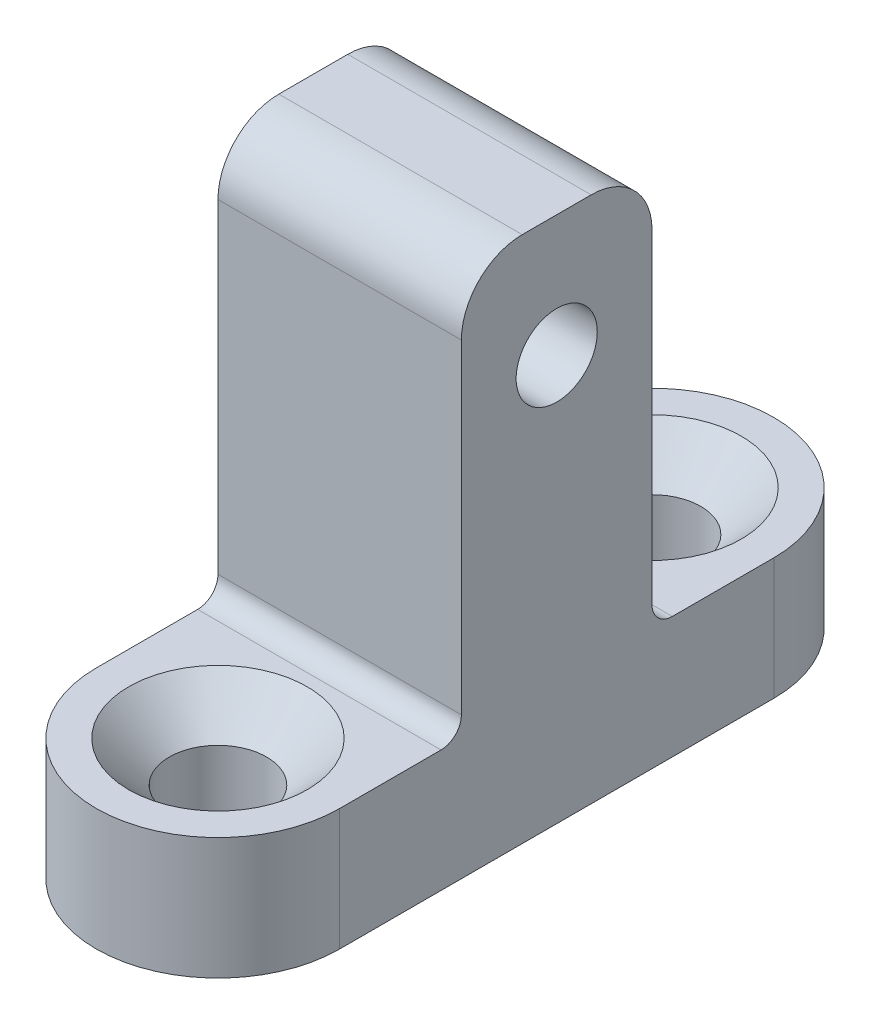
ISO-10303-21;
HEADER;
FILE_DESCRIPTION(('STEP AP214'),'2;1');
FILE_NAME('part.step','',(''),(''),'','','');
FILE_SCHEMA(('AUTOMOTIVE_DESIGN { 1 0 10303 214 1 1 1 1 }'));
ENDSEC;
DATA;
#1=APPLICATION_CONTEXT('core data for automotive mechanical design processes');
#2=APPLICATION_PROTOCOL_DEFINITION('international standard','automotive_design',2000,#1);
#3=PRODUCT_CONTEXT('',#1,'mechanical');
#4=PRODUCT('Part','Part','',(#3));
#5=PRODUCT_RELATED_PRODUCT_CATEGORY('part','',(#4));
#6=PRODUCT_DEFINITION_FORMATION('','',#4);
#7=PRODUCT_DEFINITION_CONTEXT('part definition',#1,'design');
#8=PRODUCT_DEFINITION('design','',#6,#7);
#9=PRODUCT_DEFINITION_SHAPE('','',#8);
#10=(LENGTH_UNIT() NAMED_UNIT(*) SI_UNIT(.MILLI.,.METRE.));
#11=(NAMED_UNIT(*) PLANE_ANGLE_UNIT() SI_UNIT($,.RADIAN.));
#12=(NAMED_UNIT(*) SI_UNIT($,.STERADIAN.) SOLID_ANGLE_UNIT());
#13=UNCERTAINTY_MEASURE_WITH_UNIT(LENGTH_MEASURE(1.E-05),#10,'distance_accuracy_value','');
#14=(GEOMETRIC_REPRESENTATION_CONTEXT(3) GLOBAL_UNCERTAINTY_ASSIGNED_CONTEXT((#13)) GLOBAL_UNIT_ASSIGNED_CONTEXT((#10,
#11,#12)) REPRESENTATION_CONTEXT('',''));
#15=CARTESIAN_POINT('',(0.,0.,0.));
#16=DIRECTION('',(0.,0.,1.));
#17=DIRECTION('',(1.,0.,0.));
#18=AXIS2_PLACEMENT_3D('',#15,#16,#17);
#19=CARTESIAN_POINT('',(0.,13.,2.35));
#20=DIRECTION('',(0.,0.,-1.));
#21=DIRECTION('',(-1.,0.,0.));
#22=AXIS2_PLACEMENT_3D('',#19,#20,#21);
#23=PLANE('',#22);
#24=DIRECTION('',(0.,-1.,0.));
#25=VECTOR('',#24,1.);
#26=CARTESIAN_POINT('',(3.,13.,2.35));
#27=LINE('',#26,#25);
#28=CARTESIAN_POINT('',(3.,11.5,2.35));
#29=VERTEX_POINT('',#28);
#30=CARTESIAN_POINT('',(3.,3.5,2.35));
#31=VERTEX_POINT('',#30);
#32=EDGE_CURVE('E216',#29,#31,#27,.T.);
#33=ORIENTED_EDGE('',*,*,#32,.F.);
#34=DIRECTION('',(1.,0.,0.));
#35=VECTOR('',#34,1.);
#36=CARTESIAN_POINT('',(-3.,11.5,2.35));
#37=LINE('',#36,#35);
#38=CARTESIAN_POINT('',(-3.,11.5,2.35));
#39=VERTEX_POINT('',#38);
#40=EDGE_CURVE('E74',#29,#39,#37,.F.);
#41=ORIENTED_EDGE('',*,*,#40,.T.);
#42=DIRECTION('',(0.,-1.,0.));
#43=VECTOR('',#42,1.);
#44=CARTESIAN_POINT('',(-3.,13.,2.35));
#45=LINE('',#44,#43);
#46=CARTESIAN_POINT('',(-3.,3.5,2.35));
#47=VERTEX_POINT('',#46);
#48=EDGE_CURVE('E207',#39,#47,#45,.T.);
#49=ORIENTED_EDGE('',*,*,#48,.T.);
#50=DIRECTION('',(1.,0.,0.));
#51=VECTOR('',#50,1.);
#52=CARTESIAN_POINT('',(0.,3.5,2.35));
#53=LINE('',#52,#51);
#54=EDGE_CURVE('E302',#47,#31,#53,.T.);
#55=ORIENTED_EDGE('',*,*,#54,.T.);
#56=EDGE_LOOP('',(#33,#41,#49,#55));
#57=FACE_BOUND('',#56,.T.);
#58=ADVANCED_FACE('F50',(#57),#23,.F.);
#59=CARTESIAN_POINT('',(3.,13.,0.));
#60=DIRECTION('',(1.,0.,0.));
#61=DIRECTION('',(0.,0.,-1.));
#62=AXIS2_PLACEMENT_3D('',#59,#60,#61);
#63=PLANE('',#62);
#64=CARTESIAN_POINT('',(3.000012,10.,0.));
#65=DIRECTION('',(1.,0.,0.));
#66=DIRECTION('',(0.,0.,-1.));
#67=AXIS2_PLACEMENT_3D('',#64,#65,#66);
#68=CIRCLE('',#67,1.);
#69=CARTESIAN_POINT('',(3.000012,10.,-1.));
#70=VERTEX_POINT('',#69);
#71=EDGE_CURVE('E228',#70,#70,#68,.T.);
#72=ORIENTED_EDGE('',*,*,#71,.F.);
#73=EDGE_LOOP('',(#72));
#74=FACE_BOUND('',#73,.T.);
#75=DIRECTION('',(0.,0.,1.));
#76=VECTOR('',#75,1.);
#77=CARTESIAN_POINT('',(3.,13.,0.));
#78=LINE('',#77,#76);
#79=CARTESIAN_POINT('',(3.,13.,-0.85));
#80=VERTEX_POINT('',#79);
#81=CARTESIAN_POINT('',(3.,13.,0.849999999999998));
#82=VERTEX_POINT('',#81);
#83=EDGE_CURVE('E199',#80,#82,#78,.T.);
#84=ORIENTED_EDGE('',*,*,#83,.T.);
#85=CARTESIAN_POINT('',(3.,11.5,0.849999999999998));
#86=DIRECTION('',(1.,0.,0.));
#87=DIRECTION('',(0.,0.,-1.));
#88=AXIS2_PLACEMENT_3D('',#85,#86,#87);
#89=CIRCLE('',#88,1.5);
#90=EDGE_CURVE('E280',#82,#29,#89,.T.);
#91=ORIENTED_EDGE('',*,*,#90,.T.);
#92=ORIENTED_EDGE('',*,*,#32,.T.);
#93=CARTESIAN_POINT('',(3.,3.5,2.85));
#94=DIRECTION('',(1.,0.,0.));
#95=DIRECTION('',(0.,0.,-1.));
#96=AXIS2_PLACEMENT_3D('',#93,#94,#95);
#97=CIRCLE('',#96,0.5);
#98=CARTESIAN_POINT('',(3.,3.,2.85));
#99=VERTEX_POINT('',#98);
#100=EDGE_CURVE('E292',#31,#99,#97,.F.);
#101=ORIENTED_EDGE('',*,*,#100,.T.);
#102=DIRECTION('',(0.,0.,1.));
#103=VECTOR('',#102,1.);
#104=CARTESIAN_POINT('',(3.,3.,0.));
#105=LINE('',#104,#103);
#106=CARTESIAN_POINT('',(3.,3.,5.35));
#107=VERTEX_POINT('',#106);
#108=EDGE_CURVE('E163',#99,#107,#105,.T.);
#109=ORIENTED_EDGE('',*,*,#108,.T.);
#110=DIRECTION('',(0.,-1.,0.));
#111=VECTOR('',#110,1.);
#112=CARTESIAN_POINT('',(3.,3.,5.35));
#113=LINE('',#112,#111);
#114=CARTESIAN_POINT('',(3.,0.,5.35));
#115=VERTEX_POINT('',#114);
#116=EDGE_CURVE('E158',#107,#115,#113,.T.);
#117=ORIENTED_EDGE('',*,*,#116,.T.);
#118=DIRECTION('',(0.,0.,1.));
#119=VECTOR('',#118,1.);
#120=CARTESIAN_POINT('',(3.,0.,0.));
#121=LINE('',#120,#119);
#122=CARTESIAN_POINT('',(3.,0.,-5.35));
#123=VERTEX_POINT('',#122);
#124=EDGE_CURVE('E166',#123,#115,#121,.T.);
#125=ORIENTED_EDGE('',*,*,#124,.F.);
#126=DIRECTION('',(0.,-1.,0.));
#127=VECTOR('',#126,1.);
#128=CARTESIAN_POINT('',(3.,3.,-5.35));
#129=LINE('',#128,#127);
#130=CARTESIAN_POINT('',(3.,3.,-5.35));
#131=VERTEX_POINT('',#130);
#132=EDGE_CURVE('E192',#131,#123,#129,.T.);
#133=ORIENTED_EDGE('',*,*,#132,.F.);
#134=DIRECTION('',(0.,0.,1.));
#135=VECTOR('',#134,1.);
#136=CARTESIAN_POINT('',(3.,3.,0.));
#137=LINE('',#136,#135);
#138=CARTESIAN_POINT('',(3.,3.,-2.85));
#139=VERTEX_POINT('',#138);
#140=EDGE_CURVE('E176',#131,#139,#137,.T.);
#141=ORIENTED_EDGE('',*,*,#140,.T.);
#142=CARTESIAN_POINT('',(3.,3.5,-2.85));
#143=DIRECTION('',(1.,0.,0.));
#144=DIRECTION('',(0.,0.,-1.));
#145=AXIS2_PLACEMENT_3D('',#142,#143,#144);
#146=CIRCLE('',#145,0.5);
#147=CARTESIAN_POINT('',(3.,3.5,-2.35));
#148=VERTEX_POINT('',#147);
#149=EDGE_CURVE('E296',#139,#148,#146,.F.);
#150=ORIENTED_EDGE('',*,*,#149,.T.);
#151=DIRECTION('',(0.,-1.,0.));
#152=VECTOR('',#151,1.);
#153=CARTESIAN_POINT('',(3.,13.,-2.35));
#154=LINE('',#153,#152);
#155=CARTESIAN_POINT('',(3.,11.5,-2.35));
#156=VERTEX_POINT('',#155);
#157=EDGE_CURVE('E212',#156,#148,#154,.T.);
#158=ORIENTED_EDGE('',*,*,#157,.F.);
#159=CARTESIAN_POINT('',(3.,11.5,-0.85));
#160=DIRECTION('',(1.,0.,0.));
#161=DIRECTION('',(0.,0.,-1.));
#162=AXIS2_PLACEMENT_3D('',#159,#160,#161);
#163=CIRCLE('',#162,1.5);
#164=EDGE_CURVE('E283',#156,#80,#163,.T.);
#165=ORIENTED_EDGE('',*,*,#164,.T.);
#166=EDGE_LOOP('',(#84,#91,#92,#101,#109,#117,#125,#133,#141,#150,#158,#165));
#167=FACE_BOUND('',#166,.T.);
#168=ADVANCED_FACE('F235',(#74,#167),#63,.T.);
#169=CARTESIAN_POINT('',(0.,13.,-2.35));
#170=DIRECTION('',(0.,0.,-1.));
#171=DIRECTION('',(-1.,0.,0.));
#172=AXIS2_PLACEMENT_3D('',#169,#170,#171);
#173=PLANE('',#172);
#174=DIRECTION('',(0.,-1.,0.));
#175=VECTOR('',#174,1.);
#176=CARTESIAN_POINT('',(-3.,13.,-2.35));
#177=LINE('',#176,#175);
#178=CARTESIAN_POINT('',(-3.,11.5,-2.35));
#179=VERTEX_POINT('',#178);
#180=CARTESIAN_POINT('',(-3.,3.5,-2.35));
#181=VERTEX_POINT('',#180);
#182=EDGE_CURVE('E211',#179,#181,#177,.T.);
#183=ORIENTED_EDGE('',*,*,#182,.F.);
#184=DIRECTION('',(1.,0.,0.));
#185=VECTOR('',#184,1.);
#186=CARTESIAN_POINT('',(0.,11.5,-2.35));
#187=LINE('',#186,#185);
#188=EDGE_CURVE('E11',#179,#156,#187,.T.);
#189=ORIENTED_EDGE('',*,*,#188,.T.);
#190=ORIENTED_EDGE('',*,*,#157,.T.);
#191=DIRECTION('',(1.,0.,0.));
#192=VECTOR('',#191,1.);
#193=CARTESIAN_POINT('',(-3.,3.5,-2.35));
#194=LINE('',#193,#192);
#195=EDGE_CURVE('E310',#148,#181,#194,.F.);
#196=ORIENTED_EDGE('',*,*,#195,.T.);
#197=EDGE_LOOP('',(#183,#189,#190,#196));
#198=FACE_BOUND('',#197,.T.);
#199=ADVANCED_FACE('F245',(#198),#173,.T.);
#200=CARTESIAN_POINT('',(-3.,13.,0.));
#201=DIRECTION('',(1.,0.,0.));
#202=DIRECTION('',(0.,0.,-1.));
#203=AXIS2_PLACEMENT_3D('',#200,#201,#202);
#204=PLANE('',#203);
#205=CARTESIAN_POINT('',(-3.,10.,0.));
#206=DIRECTION('',(1.,0.,0.));
#207=DIRECTION('',(0.,0.,-1.));
#208=AXIS2_PLACEMENT_3D('',#205,#206,#207);
#209=CIRCLE('',#208,1.);
#210=CARTESIAN_POINT('',(-3.,10.,-1.));
#211=VERTEX_POINT('',#210);
#212=EDGE_CURVE('E191',#211,#211,#209,.T.);
#213=ORIENTED_EDGE('',*,*,#212,.T.);
#214=EDGE_LOOP('',(#213));
#215=FACE_BOUND('',#214,.T.);
#216=ORIENTED_EDGE('',*,*,#48,.F.);
#217=CARTESIAN_POINT('',(-3.,11.5,0.849999999999999));
#218=DIRECTION('',(1.,0.,0.));
#219=DIRECTION('',(0.,0.,-1.));
#220=AXIS2_PLACEMENT_3D('',#217,#218,#219);
#221=CIRCLE('',#220,1.5);
#222=CARTESIAN_POINT('',(-3.,13.,0.849999999999999));
#223=VERTEX_POINT('',#222);
#224=EDGE_CURVE('E57',#39,#223,#221,.F.);
#225=ORIENTED_EDGE('',*,*,#224,.T.);
#226=DIRECTION('',(0.,0.,1.));
#227=VECTOR('',#226,1.);
#228=CARTESIAN_POINT('',(-3.,13.,0.));
#229=LINE('',#228,#227);
#230=CARTESIAN_POINT('',(-3.,13.,-0.849999999999999));
#231=VERTEX_POINT('',#230);
#232=EDGE_CURVE('E205',#231,#223,#229,.T.);
#233=ORIENTED_EDGE('',*,*,#232,.F.);
#234=CARTESIAN_POINT('',(-3.,11.5,-0.849999999999999));
#235=DIRECTION('',(1.,0.,0.));
#236=DIRECTION('',(0.,0.,-1.));
#237=AXIS2_PLACEMENT_3D('',#234,#235,#236);
#238=CIRCLE('',#237,1.5);
#239=EDGE_CURVE('E65',#231,#179,#238,.F.);
#240=ORIENTED_EDGE('',*,*,#239,.T.);
#241=ORIENTED_EDGE('',*,*,#182,.T.);
#242=CARTESIAN_POINT('',(-3.,3.5,-2.85));
#243=DIRECTION('',(1.,0.,0.));
#244=DIRECTION('',(0.,0.,-1.));
#245=AXIS2_PLACEMENT_3D('',#242,#243,#244);
#246=CIRCLE('',#245,0.5);
#247=CARTESIAN_POINT('',(-3.,3.,-2.85));
#248=VERTEX_POINT('',#247);
#249=EDGE_CURVE('E294',#181,#248,#246,.T.);
#250=ORIENTED_EDGE('',*,*,#249,.T.);
#251=DIRECTION('',(0.,0.,1.));
#252=VECTOR('',#251,1.);
#253=CARTESIAN_POINT('',(-3.,3.,0.));
#254=LINE('',#253,#252);
#255=CARTESIAN_POINT('',(-3.,3.,-5.35));
#256=VERTEX_POINT('',#255);
#257=EDGE_CURVE('E183',#256,#248,#254,.T.);
#258=ORIENTED_EDGE('',*,*,#257,.F.);
#259=DIRECTION('',(0.,-1.,0.));
#260=VECTOR('',#259,1.);
#261=CARTESIAN_POINT('',(-3.,3.,-5.35));
#262=LINE('',#261,#260);
#263=CARTESIAN_POINT('',(-3.,0.,-5.35));
#264=VERTEX_POINT('',#263);
#265=EDGE_CURVE('E189',#256,#264,#262,.T.);
#266=ORIENTED_EDGE('',*,*,#265,.T.);
#267=DIRECTION('',(0.,0.,1.));
#268=VECTOR('',#267,1.);
#269=CARTESIAN_POINT('',(-3.,0.,0.));
#270=LINE('',#269,#268);
#271=CARTESIAN_POINT('',(-3.,0.,5.35));
#272=VERTEX_POINT('',#271);
#273=EDGE_CURVE('E164',#264,#272,#270,.T.);
#274=ORIENTED_EDGE('',*,*,#273,.T.);
#275=DIRECTION('',(0.,-1.,0.));
#276=VECTOR('',#275,1.);
#277=CARTESIAN_POINT('',(-3.,3.,5.35));
#278=LINE('',#277,#276);
#279=CARTESIAN_POINT('',(-3.,3.,5.35));
#280=VERTEX_POINT('',#279);
#281=EDGE_CURVE('E156',#280,#272,#278,.T.);
#282=ORIENTED_EDGE('',*,*,#281,.F.);
#283=DIRECTION('',(0.,0.,1.));
#284=VECTOR('',#283,1.);
#285=CARTESIAN_POINT('',(-3.,3.,0.));
#286=LINE('',#285,#284);
#287=CARTESIAN_POINT('',(-3.,3.,2.85));
#288=VERTEX_POINT('',#287);
#289=EDGE_CURVE('E138',#288,#280,#286,.T.);
#290=ORIENTED_EDGE('',*,*,#289,.F.);
#291=CARTESIAN_POINT('',(-3.,3.5,2.85));
#292=DIRECTION('',(1.,0.,0.));
#293=DIRECTION('',(0.,0.,-1.));
#294=AXIS2_PLACEMENT_3D('',#291,#292,#293);
#295=CIRCLE('',#294,0.5);
#296=EDGE_CURVE('E288',#288,#47,#295,.T.);
#297=ORIENTED_EDGE('',*,*,#296,.T.);
#298=EDGE_LOOP('',(#216,#225,#233,#240,#241,#250,#258,#266,#274,#282,#290,#297));
#299=FACE_BOUND('',#298,.T.);
#300=ADVANCED_FACE('F161',(#215,#299),#204,.F.);
#301=CARTESIAN_POINT('',(0.,13.,0.));
#302=DIRECTION('',(0.,1.,0.));
#303=DIRECTION('',(0.,0.,1.));
#304=AXIS2_PLACEMENT_3D('',#301,#302,#303);
#305=PLANE('',#304);
#306=ORIENTED_EDGE('',*,*,#232,.T.);
#307=DIRECTION('',(1.,0.,0.));
#308=VECTOR('',#307,1.);
#309=CARTESIAN_POINT('',(3.,13.,0.849999999999998));
#310=LINE('',#309,#308);
#311=EDGE_CURVE('E272',#223,#82,#310,.T.);
#312=ORIENTED_EDGE('',*,*,#311,.T.);
#313=ORIENTED_EDGE('',*,*,#83,.F.);
#314=DIRECTION('',(1.,0.,0.));
#315=VECTOR('',#314,1.);
#316=CARTESIAN_POINT('',(0.,13.,-0.849999999999999));
#317=LINE('',#316,#315);
#318=EDGE_CURVE('E289',#80,#231,#317,.F.);
#319=ORIENTED_EDGE('',*,*,#318,.T.);
#320=EDGE_LOOP('',(#306,#312,#313,#319));
#321=FACE_BOUND('',#320,.T.);
#322=ADVANCED_FACE('F334',(#321),#305,.T.);
#323=CARTESIAN_POINT('',(0.,0.,0.));
#324=DIRECTION('',(0.,1.,0.));
#325=DIRECTION('',(0.,0.,1.));
#326=AXIS2_PLACEMENT_3D('',#323,#324,#325);
#327=PLANE('',#326);
#328=CARTESIAN_POINT('',(0.,0.,5.35));
#329=DIRECTION('',(0.,1.,0.));
#330=DIRECTION('',(0.,0.,1.));
#331=AXIS2_PLACEMENT_3D('',#328,#329,#330);
#332=CIRCLE('',#331,1.2);
#333=CARTESIAN_POINT('',(0.,0.,6.55));
#334=VERTEX_POINT('',#333);
#335=EDGE_CURVE('E384',#334,#334,#332,.F.);
#336=ORIENTED_EDGE('',*,*,#335,.F.);
#337=EDGE_LOOP('',(#336));
#338=FACE_BOUND('',#337,.T.);
#339=CARTESIAN_POINT('',(0.,0.,-5.35));
#340=DIRECTION('',(0.,1.,0.));
#341=DIRECTION('',(0.,0.,1.));
#342=AXIS2_PLACEMENT_3D('',#339,#340,#341);
#343=CIRCLE('',#342,1.2);
#344=CARTESIAN_POINT('',(0.,0.,-4.15));
#345=VERTEX_POINT('',#344);
#346=EDGE_CURVE('E392',#345,#345,#343,.F.);
#347=ORIENTED_EDGE('',*,*,#346,.F.);
#348=EDGE_LOOP('',(#347));
#349=FACE_BOUND('',#348,.T.);
#350=ORIENTED_EDGE('',*,*,#124,.T.);
#351=CARTESIAN_POINT('',(0.,0.,5.35));
#352=DIRECTION('',(0.,1.,0.));
#353=DIRECTION('',(0.,0.,1.));
#354=AXIS2_PLACEMENT_3D('',#351,#352,#353);
#355=CIRCLE('',#354,3.);
#356=EDGE_CURVE('E153',#272,#115,#355,.T.);
#357=ORIENTED_EDGE('',*,*,#356,.F.);
#358=ORIENTED_EDGE('',*,*,#273,.F.);
#359=CARTESIAN_POINT('',(0.,0.,-5.35));
#360=DIRECTION('',(0.,1.,0.));
#361=DIRECTION('',(0.,0.,1.));
#362=AXIS2_PLACEMENT_3D('',#359,#360,#361);
#363=CIRCLE('',#362,3.);
#364=EDGE_CURVE('E181',#123,#264,#363,.T.);
#365=ORIENTED_EDGE('',*,*,#364,.F.);
#366=EDGE_LOOP('',(#350,#357,#358,#365));
#367=FACE_BOUND('',#366,.T.);
#368=ADVANCED_FACE('F331',(#338,#349,#367),#327,.F.);
#369=CARTESIAN_POINT('',(0.,3.,-5.35));
#370=DIRECTION('',(0.,-1.,0.));
#371=DIRECTION('',(0.,0.,-1.));
#372=AXIS2_PLACEMENT_3D('',#369,#370,#371);
#373=CYLINDRICAL_SURFACE('',#372,3.);
#374=ORIENTED_EDGE('',*,*,#364,.T.);
#375=ORIENTED_EDGE('',*,*,#265,.F.);
#376=CARTESIAN_POINT('',(0.,3.,-5.35));
#377=DIRECTION('',(0.,1.,0.));
#378=DIRECTION('',(0.,0.,1.));
#379=AXIS2_PLACEMENT_3D('',#376,#377,#378);
#380=CIRCLE('',#379,3.);
#381=EDGE_CURVE('E179',#131,#256,#380,.T.);
#382=ORIENTED_EDGE('',*,*,#381,.F.);
#383=ORIENTED_EDGE('',*,*,#132,.T.);
#384=EDGE_LOOP('',(#374,#375,#382,#383));
#385=FACE_BOUND('',#384,.T.);
#386=ADVANCED_FACE('F328',(#385),#373,.T.);
#387=CARTESIAN_POINT('',(0.,3.,0.));
#388=DIRECTION('',(0.,1.,0.));
#389=DIRECTION('',(0.,0.,1.));
#390=AXIS2_PLACEMENT_3D('',#387,#388,#389);
#391=PLANE('',#390);
#392=CARTESIAN_POINT('',(0.,3.,-5.35));
#393=DIRECTION('',(0.,1.,0.));
#394=DIRECTION('',(0.,0.,1.));
#395=AXIS2_PLACEMENT_3D('',#392,#393,#394);
#396=CIRCLE('',#395,2.2);
#397=CARTESIAN_POINT('',(0.,3.,-3.15));
#398=VERTEX_POINT('',#397);
#399=EDGE_CURVE('E376',#398,#398,#396,.T.);
#400=ORIENTED_EDGE('',*,*,#399,.F.);
#401=EDGE_LOOP('',(#400));
#402=FACE_BOUND('',#401,.T.);
#403=ORIENTED_EDGE('',*,*,#257,.T.);
#404=DIRECTION('',(1.,0.,0.));
#405=VECTOR('',#404,1.);
#406=CARTESIAN_POINT('',(3.,3.,-2.85));
#407=LINE('',#406,#405);
#408=EDGE_CURVE('E224',#248,#139,#407,.T.);
#409=ORIENTED_EDGE('',*,*,#408,.T.);
#410=ORIENTED_EDGE('',*,*,#140,.F.);
#411=ORIENTED_EDGE('',*,*,#381,.T.);
#412=EDGE_LOOP('',(#403,#409,#410,#411));
#413=FACE_BOUND('',#412,.T.);
#414=ADVANCED_FACE('F319',(#402,#413),#391,.T.);
#415=CARTESIAN_POINT('',(0.,3.,5.35));
#416=DIRECTION('',(0.,-1.,0.));
#417=DIRECTION('',(0.,0.,-1.));
#418=AXIS2_PLACEMENT_3D('',#415,#416,#417);
#419=CYLINDRICAL_SURFACE('',#418,3.);
#420=ORIENTED_EDGE('',*,*,#356,.T.);
#421=ORIENTED_EDGE('',*,*,#116,.F.);
#422=CARTESIAN_POINT('',(0.,3.,5.35));
#423=DIRECTION('',(0.,1.,0.));
#424=DIRECTION('',(0.,0.,1.));
#425=AXIS2_PLACEMENT_3D('',#422,#423,#424);
#426=CIRCLE('',#425,3.);
#427=EDGE_CURVE('E141',#280,#107,#426,.T.);
#428=ORIENTED_EDGE('',*,*,#427,.F.);
#429=ORIENTED_EDGE('',*,*,#281,.T.);
#430=EDGE_LOOP('',(#420,#421,#428,#429));
#431=FACE_BOUND('',#430,.T.);
#432=ADVANCED_FACE('F159',(#431),#419,.T.);
#433=CARTESIAN_POINT('',(0.,3.,0.));
#434=DIRECTION('',(0.,1.,0.));
#435=DIRECTION('',(0.,0.,1.));
#436=AXIS2_PLACEMENT_3D('',#433,#434,#435);
#437=PLANE('',#436);
#438=CARTESIAN_POINT('',(0.,3.,5.35));
#439=DIRECTION('',(0.,1.,0.));
#440=DIRECTION('',(0.,0.,1.));
#441=AXIS2_PLACEMENT_3D('',#438,#439,#440);
#442=CIRCLE('',#441,2.2);
#443=CARTESIAN_POINT('',(0.,3.,7.55));
#444=VERTEX_POINT('',#443);
#445=EDGE_CURVE('E378',#444,#444,#442,.T.);
#446=ORIENTED_EDGE('',*,*,#445,.F.);
#447=EDGE_LOOP('',(#446));
#448=FACE_BOUND('',#447,.T.);
#449=ORIENTED_EDGE('',*,*,#108,.F.);
#450=DIRECTION('',(1.,0.,0.));
#451=VECTOR('',#450,1.);
#452=CARTESIAN_POINT('',(0.,3.,2.85));
#453=LINE('',#452,#451);
#454=EDGE_CURVE('E149',#99,#288,#453,.F.);
#455=ORIENTED_EDGE('',*,*,#454,.T.);
#456=ORIENTED_EDGE('',*,*,#289,.T.);
#457=ORIENTED_EDGE('',*,*,#427,.T.);
#458=EDGE_LOOP('',(#449,#455,#456,#457));
#459=FACE_BOUND('',#458,.T.);
#460=ADVANCED_FACE('F145',(#448,#459),#437,.T.);
#461=CARTESIAN_POINT('',(-3.,10.,0.));
#462=DIRECTION('',(1.,0.,0.));
#463=DIRECTION('',(0.,0.,-1.));
#464=AXIS2_PLACEMENT_3D('',#461,#462,#463);
#465=CYLINDRICAL_SURFACE('',#464,1.);
#466=ORIENTED_EDGE('',*,*,#212,.F.);
#467=EDGE_LOOP('',(#466));
#468=FACE_BOUND('',#467,.T.);
#469=ORIENTED_EDGE('',*,*,#71,.T.);
#470=EDGE_LOOP('',(#469));
#471=FACE_BOUND('',#470,.T.);
#472=ADVANCED_FACE('F249',(#468,#471),#465,.F.);
#473=CARTESIAN_POINT('',(0.,3.5,-2.85));
#474=DIRECTION('',(-1.,0.,0.));
#475=DIRECTION('',(0.,0.,1.));
#476=AXIS2_PLACEMENT_3D('',#473,#474,#475);
#477=CYLINDRICAL_SURFACE('',#476,0.5);
#478=ORIENTED_EDGE('',*,*,#249,.F.);
#479=ORIENTED_EDGE('',*,*,#195,.F.);
#480=ORIENTED_EDGE('',*,*,#149,.F.);
#481=ORIENTED_EDGE('',*,*,#408,.F.);
#482=EDGE_LOOP('',(#478,#479,#480,#481));
#483=FACE_BOUND('',#482,.T.);
#484=ADVANCED_FACE('F246',(#483),#477,.F.);
#485=CARTESIAN_POINT('',(0.,3.5,2.85));
#486=DIRECTION('',(1.,0.,0.));
#487=DIRECTION('',(0.,0.,-1.));
#488=AXIS2_PLACEMENT_3D('',#485,#486,#487);
#489=CYLINDRICAL_SURFACE('',#488,0.5);
#490=ORIENTED_EDGE('',*,*,#296,.F.);
#491=ORIENTED_EDGE('',*,*,#454,.F.);
#492=ORIENTED_EDGE('',*,*,#100,.F.);
#493=ORIENTED_EDGE('',*,*,#54,.F.);
#494=EDGE_LOOP('',(#490,#491,#492,#493));
#495=FACE_BOUND('',#494,.T.);
#496=ADVANCED_FACE('F248',(#495),#489,.F.);
#497=CARTESIAN_POINT('',(0.,3.,-5.35));
#498=DIRECTION('',(0.,1.,0.));
#499=DIRECTION('',(0.,0.,1.));
#500=AXIS2_PLACEMENT_3D('',#497,#498,#499);
#501=CONICAL_SURFACE('',#500,2.2,0.785398163397449);
#502=CARTESIAN_POINT('',(0.,2.,-5.35));
#503=DIRECTION('',(0.,1.,0.));
#504=DIRECTION('',(0.,0.,1.));
#505=AXIS2_PLACEMENT_3D('',#502,#503,#504);
#506=CIRCLE('',#505,1.2);
#507=CARTESIAN_POINT('',(0.,2.,-4.15));
#508=VERTEX_POINT('',#507);
#509=EDGE_CURVE('E393',#508,#508,#506,.T.);
#510=ORIENTED_EDGE('',*,*,#509,.F.);
#511=EDGE_LOOP('',(#510));
#512=FACE_BOUND('',#511,.T.);
#513=ORIENTED_EDGE('',*,*,#399,.T.);
#514=EDGE_LOOP('',(#513));
#515=FACE_BOUND('',#514,.T.);
#516=ADVANCED_FACE('F254',(#512,#515),#501,.F.);
#517=CARTESIAN_POINT('',(0.,3.,5.35));
#518=DIRECTION('',(0.,1.,0.));
#519=DIRECTION('',(0.,0.,1.));
#520=AXIS2_PLACEMENT_3D('',#517,#518,#519);
#521=CONICAL_SURFACE('',#520,2.2,0.785398163397449);
#522=CARTESIAN_POINT('',(0.,2.,5.35));
#523=DIRECTION('',(0.,1.,0.));
#524=DIRECTION('',(0.,0.,1.));
#525=AXIS2_PLACEMENT_3D('',#522,#523,#524);
#526=CIRCLE('',#525,1.2);
#527=CARTESIAN_POINT('',(0.,2.,6.55));
#528=VERTEX_POINT('',#527);
#529=EDGE_CURVE('E386',#528,#528,#526,.T.);
#530=ORIENTED_EDGE('',*,*,#529,.F.);
#531=EDGE_LOOP('',(#530));
#532=FACE_BOUND('',#531,.T.);
#533=ORIENTED_EDGE('',*,*,#445,.T.);
#534=EDGE_LOOP('',(#533));
#535=FACE_BOUND('',#534,.T.);
#536=ADVANCED_FACE('F256',(#532,#535),#521,.F.);
#537=CARTESIAN_POINT('',(0.,11.5,0.849999999999999));
#538=DIRECTION('',(-1.,0.,0.));
#539=DIRECTION('',(0.,0.,1.));
#540=AXIS2_PLACEMENT_3D('',#537,#538,#539);
#541=CYLINDRICAL_SURFACE('',#540,1.5);
#542=ORIENTED_EDGE('',*,*,#224,.F.);
#543=ORIENTED_EDGE('',*,*,#40,.F.);
#544=ORIENTED_EDGE('',*,*,#90,.F.);
#545=ORIENTED_EDGE('',*,*,#311,.F.);
#546=EDGE_LOOP('',(#542,#543,#544,#545));
#547=FACE_BOUND('',#546,.T.);
#548=ADVANCED_FACE('F253',(#547),#541,.T.);
#549=CARTESIAN_POINT('',(0.,11.5,-0.849999999999999));
#550=DIRECTION('',(1.,0.,0.));
#551=DIRECTION('',(0.,0.,-1.));
#552=AXIS2_PLACEMENT_3D('',#549,#550,#551);
#553=CYLINDRICAL_SURFACE('',#552,1.5);
#554=ORIENTED_EDGE('',*,*,#239,.F.);
#555=ORIENTED_EDGE('',*,*,#318,.F.);
#556=ORIENTED_EDGE('',*,*,#164,.F.);
#557=ORIENTED_EDGE('',*,*,#188,.F.);
#558=EDGE_LOOP('',(#554,#555,#556,#557));
#559=FACE_BOUND('',#558,.T.);
#560=ADVANCED_FACE('F47',(#559),#553,.T.);
#561=CARTESIAN_POINT('',(0.,-0.00100000000000013,-5.35));
#562=DIRECTION('',(0.,1.,0.));
#563=DIRECTION('',(0.,0.,1.));
#564=AXIS2_PLACEMENT_3D('',#561,#562,#563);
#565=CYLINDRICAL_SURFACE('',#564,1.2);
#566=ORIENTED_EDGE('',*,*,#509,.T.);
#567=EDGE_LOOP('',(#566));
#568=FACE_BOUND('',#567,.T.);
#569=ORIENTED_EDGE('',*,*,#346,.T.);
#570=EDGE_LOOP('',(#569));
#571=FACE_BOUND('',#570,.T.);
#572=ADVANCED_FACE('F261',(#568,#571),#565,.F.);
#573=CARTESIAN_POINT('',(0.,-0.00100000000000013,5.35));
#574=DIRECTION('',(0.,1.,0.));
#575=DIRECTION('',(0.,0.,1.));
#576=AXIS2_PLACEMENT_3D('',#573,#574,#575);
#577=CYLINDRICAL_SURFACE('',#576,1.2);
#578=ORIENTED_EDGE('',*,*,#529,.T.);
#579=EDGE_LOOP('',(#578));
#580=FACE_BOUND('',#579,.T.);
#581=ORIENTED_EDGE('',*,*,#335,.T.);
#582=EDGE_LOOP('',(#581));
#583=FACE_BOUND('',#582,.T.);
#584=ADVANCED_FACE('F401',(#580,#583),#577,.F.);
#585=CLOSED_SHELL('',(#58,#168,#199,#300,#322,#368,#386,#414,#432,#460,#472,#484,#496,#516,#536,
#548,#560,#572,#584));
#586=MANIFOLD_SOLID_BREP('B2',#585);
#587=ADVANCED_BREP_SHAPE_REPRESENTATION('',(#18,#586),#14);
#588=SHAPE_DEFINITION_REPRESENTATION(#9,#587);
ENDSEC;
END-ISO-10303-21;
